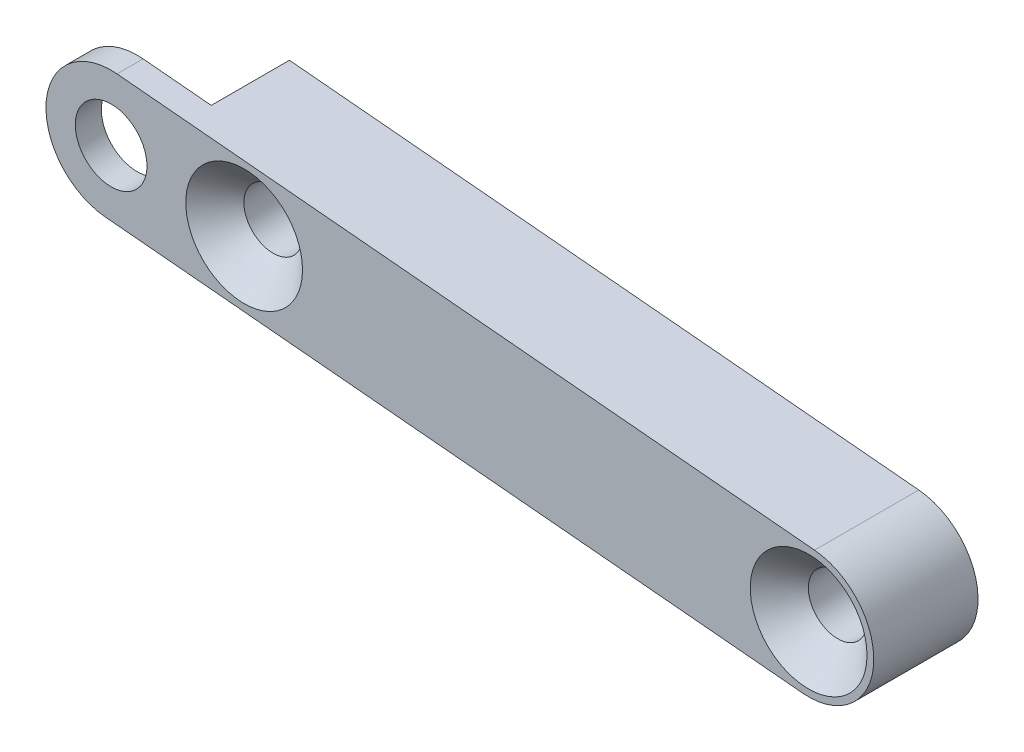
ISO-10303-21;
HEADER;
FILE_DESCRIPTION(('STEP AP214'),'2;1');
FILE_NAME('part.step','',(''),(''),'','','');
FILE_SCHEMA(('AUTOMOTIVE_DESIGN { 1 0 10303 214 1 1 1 1 }'));
ENDSEC;
DATA;
#1=APPLICATION_CONTEXT('core data for automotive mechanical design processes');
#2=APPLICATION_PROTOCOL_DEFINITION('international standard','automotive_design',2000,#1);
#3=PRODUCT_CONTEXT('',#1,'mechanical');
#4=PRODUCT('Part','Part','',(#3));
#5=PRODUCT_RELATED_PRODUCT_CATEGORY('part','',(#4));
#6=PRODUCT_DEFINITION_FORMATION('','',#4);
#7=PRODUCT_DEFINITION_CONTEXT('part definition',#1,'design');
#8=PRODUCT_DEFINITION('design','',#6,#7);
#9=PRODUCT_DEFINITION_SHAPE('','',#8);
#10=(LENGTH_UNIT() NAMED_UNIT(*) SI_UNIT(.MILLI.,.METRE.));
#11=(NAMED_UNIT(*) PLANE_ANGLE_UNIT() SI_UNIT($,.RADIAN.));
#12=(NAMED_UNIT(*) SI_UNIT($,.STERADIAN.) SOLID_ANGLE_UNIT());
#13=UNCERTAINTY_MEASURE_WITH_UNIT(LENGTH_MEASURE(1.E-05),#10,'distance_accuracy_value','');
#14=(GEOMETRIC_REPRESENTATION_CONTEXT(3) GLOBAL_UNCERTAINTY_ASSIGNED_CONTEXT((#13)) GLOBAL_UNIT_ASSIGNED_CONTEXT((#10,
#11,#12)) REPRESENTATION_CONTEXT('',''));
#15=CARTESIAN_POINT('',(0.,0.,0.));
#16=DIRECTION('',(0.,0.,1.));
#17=DIRECTION('',(1.,0.,0.));
#18=AXIS2_PLACEMENT_3D('',#15,#16,#17);
#19=CARTESIAN_POINT('',(39.8243195955887,35.0805183757008,-19.0881454656349));
#20=DIRECTION('',(0.,0.,1.));
#21=DIRECTION('',(1.,0.,0.));
#22=AXIS2_PLACEMENT_3D('',#19,#20,#21);
#23=CYLINDRICAL_SURFACE('',#22,5.);
#24=DIRECTION('',(0.,0.,1.));
#25=VECTOR('',#24,1.);
#26=CARTESIAN_POINT('',(40.2789154793188,40.0598097492294,-19.0881454656349));
#27=LINE('',#26,#25);
#28=CARTESIAN_POINT('',(40.2789154793188,40.0598097492294,6.));
#29=VERTEX_POINT('',#28);
#30=CARTESIAN_POINT('',(40.2789154793188,40.0598097492294,8.));
#31=VERTEX_POINT('',#30);
#32=EDGE_CURVE('E111',#29,#31,#27,.T.);
#33=ORIENTED_EDGE('',*,*,#32,.F.);
#34=CARTESIAN_POINT('',(39.8243195955887,35.0805183757008,6.));
#35=DIRECTION('',(0.,0.,-1.));
#36=DIRECTION('',(-1.,0.,0.));
#37=AXIS2_PLACEMENT_3D('',#34,#35,#36);
#38=CIRCLE('',#37,5.);
#39=CARTESIAN_POINT('',(39.3697237118586,30.1012270021723,6.));
#40=VERTEX_POINT('',#39);
#41=EDGE_CURVE('E11',#29,#40,#38,.F.);
#42=ORIENTED_EDGE('',*,*,#41,.T.);
#43=DIRECTION('',(0.,0.,1.));
#44=VECTOR('',#43,1.);
#45=CARTESIAN_POINT('',(39.3697237118586,30.1012270021723,-19.0881454656349));
#46=LINE('',#45,#44);
#47=CARTESIAN_POINT('',(39.3697237118586,30.1012270021723,8.));
#48=VERTEX_POINT('',#47);
#49=EDGE_CURVE('E130',#40,#48,#46,.T.);
#50=ORIENTED_EDGE('',*,*,#49,.T.);
#51=CARTESIAN_POINT('',(39.8243195955887,35.0805183757008,8.));
#52=DIRECTION('',(0.,0.,1.));
#53=DIRECTION('',(1.,0.,0.));
#54=AXIS2_PLACEMENT_3D('',#51,#52,#53);
#55=CIRCLE('',#54,5.);
#56=EDGE_CURVE('E133',#31,#48,#55,.T.);
#57=ORIENTED_EDGE('',*,*,#56,.F.);
#58=EDGE_LOOP('',(#33,#42,#50,#57));
#59=FACE_BOUND('',#58,.T.);
#60=ADVANCED_FACE('F35',(#59),#23,.T.);
#61=CARTESIAN_POINT('',(93.3517018610204,30.1936126256023,8.));
#62=DIRECTION('',(0.,0.,-1.));
#63=DIRECTION('',(-1.,0.,0.));
#64=AXIS2_PLACEMENT_3D('',#61,#62,#63);
#65=CYLINDRICAL_SURFACE('',#64,5.);
#66=CARTESIAN_POINT('',(93.3517018610204,30.1936126256023,0.));
#67=DIRECTION('',(0.,0.,1.));
#68=DIRECTION('',(1.,0.,0.));
#69=AXIS2_PLACEMENT_3D('',#66,#67,#68);
#70=CIRCLE('',#69,5.);
#71=CARTESIAN_POINT('',(92.8971059772903,25.2143212520737,0.));
#72=VERTEX_POINT('',#71);
#73=CARTESIAN_POINT('',(93.8062977447505,35.1729039991308,0.));
#74=VERTEX_POINT('',#73);
#75=EDGE_CURVE('E89',#72,#74,#70,.T.);
#76=ORIENTED_EDGE('',*,*,#75,.T.);
#77=DIRECTION('',(0.,0.,-1.));
#78=VECTOR('',#77,1.);
#79=CARTESIAN_POINT('',(93.8062977447505,35.1729039991308,8.));
#80=LINE('',#79,#78);
#81=CARTESIAN_POINT('',(93.8062977447505,35.1729039991308,8.));
#82=VERTEX_POINT('',#81);
#83=EDGE_CURVE('E43',#82,#74,#80,.T.);
#84=ORIENTED_EDGE('',*,*,#83,.F.);
#85=CARTESIAN_POINT('',(93.3517018610204,30.1936126256023,8.));
#86=DIRECTION('',(0.,0.,1.));
#87=DIRECTION('',(1.,0.,0.));
#88=AXIS2_PLACEMENT_3D('',#85,#86,#87);
#89=CIRCLE('',#88,5.);
#90=CARTESIAN_POINT('',(92.8971059772903,25.2143212520737,8.));
#91=VERTEX_POINT('',#90);
#92=EDGE_CURVE('E83',#91,#82,#89,.T.);
#93=ORIENTED_EDGE('',*,*,#92,.F.);
#94=DIRECTION('',(0.,0.,-1.));
#95=VECTOR('',#94,1.);
#96=CARTESIAN_POINT('',(92.8971059772903,25.2143212520737,8.));
#97=LINE('',#96,#95);
#98=EDGE_CURVE('E75',#91,#72,#97,.T.);
#99=ORIENTED_EDGE('',*,*,#98,.T.);
#100=EDGE_LOOP('',(#76,#84,#93,#99));
#101=FACE_BOUND('',#100,.T.);
#102=ADVANCED_FACE('F37',(#101),#65,.T.);
#103=CARTESIAN_POINT('',(93.8062977447505,35.1729039991308,8.));
#104=DIRECTION('',(-0.0909191767460206,-0.995858274705706,0.));
#105=DIRECTION('',(0.995858274705706,-0.0909191767460206,0.));
#106=AXIS2_PLACEMENT_3D('',#103,#104,#105);
#107=PLANE('',#106);
#108=DIRECTION('',(-0.995858274705706,0.0909191767460206,0.));
#109=VECTOR('',#108,1.);
#110=CARTESIAN_POINT('',(93.8062977447505,35.1729039991308,0.));
#111=LINE('',#110,#109);
#112=CARTESIAN_POINT('',(45.5071714215237,39.5824840713128,0.));
#113=VERTEX_POINT('',#112);
#114=EDGE_CURVE('E84',#74,#113,#111,.T.);
#115=ORIENTED_EDGE('',*,*,#114,.T.);
#116=DIRECTION('',(0.,0.,1.));
#117=VECTOR('',#116,1.);
#118=CARTESIAN_POINT('',(45.5071714215237,39.5824840713128,8.));
#119=LINE('',#118,#117);
#120=CARTESIAN_POINT('',(45.5071714215237,39.5824840713128,6.));
#121=VERTEX_POINT('',#120);
#122=EDGE_CURVE('E136',#113,#121,#119,.T.);
#123=ORIENTED_EDGE('',*,*,#122,.T.);
#124=DIRECTION('',(0.995858274705706,-0.0909191767460206,0.));
#125=VECTOR('',#124,1.);
#126=CARTESIAN_POINT('',(93.8062977447505,35.1729039991308,6.));
#127=LINE('',#126,#125);
#128=EDGE_CURVE('E139',#29,#121,#127,.T.);
#129=ORIENTED_EDGE('',*,*,#128,.F.);
#130=ORIENTED_EDGE('',*,*,#32,.T.);
#131=DIRECTION('',(-0.995858274705706,0.0909191767460206,0.));
#132=VECTOR('',#131,1.);
#133=CARTESIAN_POINT('',(93.8062977447505,35.1729039991308,8.));
#134=LINE('',#133,#132);
#135=EDGE_CURVE('E108',#82,#31,#134,.T.);
#136=ORIENTED_EDGE('',*,*,#135,.F.);
#137=ORIENTED_EDGE('',*,*,#83,.T.);
#138=EDGE_LOOP('',(#115,#123,#129,#130,#136,#137));
#139=FACE_BOUND('',#138,.T.);
#140=ADVANCED_FACE('F103',(#139),#107,.F.);
#141=CARTESIAN_POINT('',(92.8971059772903,25.2143212520737,8.));
#142=DIRECTION('',(0.0909191767460206,0.995858274705706,0.));
#143=DIRECTION('',(-0.995858274705706,0.0909191767460206,0.));
#144=AXIS2_PLACEMENT_3D('',#141,#142,#143);
#145=PLANE('',#144);
#146=DIRECTION('',(-0.995858274705706,0.0909191767460206,0.));
#147=VECTOR('',#146,1.);
#148=CARTESIAN_POINT('',(92.8971059772903,25.2143212520737,6.));
#149=LINE('',#148,#147);
#150=CARTESIAN_POINT('',(44.5979796540635,29.6239013242557,6.));
#151=VERTEX_POINT('',#150);
#152=EDGE_CURVE('E50',#151,#40,#149,.T.);
#153=ORIENTED_EDGE('',*,*,#152,.F.);
#154=DIRECTION('',(0.,0.,-1.));
#155=VECTOR('',#154,1.);
#156=CARTESIAN_POINT('',(44.5979796540635,29.6239013242557,8.));
#157=LINE('',#156,#155);
#158=CARTESIAN_POINT('',(44.5979796540635,29.6239013242557,0.));
#159=VERTEX_POINT('',#158);
#160=EDGE_CURVE('E79',#151,#159,#157,.T.);
#161=ORIENTED_EDGE('',*,*,#160,.T.);
#162=DIRECTION('',(0.995858274705706,-0.0909191767460206,0.));
#163=VECTOR('',#162,1.);
#164=CARTESIAN_POINT('',(92.8971059772903,25.2143212520737,0.));
#165=LINE('',#164,#163);
#166=EDGE_CURVE('E72',#159,#72,#165,.T.);
#167=ORIENTED_EDGE('',*,*,#166,.T.);
#168=ORIENTED_EDGE('',*,*,#98,.F.);
#169=DIRECTION('',(0.995858274705706,-0.0909191767460206,0.));
#170=VECTOR('',#169,1.);
#171=CARTESIAN_POINT('',(92.8971059772903,25.2143212520737,8.));
#172=LINE('',#171,#170);
#173=EDGE_CURVE('E58',#48,#91,#172,.T.);
#174=ORIENTED_EDGE('',*,*,#173,.F.);
#175=ORIENTED_EDGE('',*,*,#49,.F.);
#176=EDGE_LOOP('',(#153,#161,#167,#168,#174,#175));
#177=FACE_BOUND('',#176,.T.);
#178=ADVANCED_FACE('F74',(#177),#145,.F.);
#179=CARTESIAN_POINT('',(93.3517018610204,30.1936126256023,8.));
#180=DIRECTION('',(0.,0.,1.));
#181=DIRECTION('',(1.,0.,0.));
#182=AXIS2_PLACEMENT_3D('',#179,#180,#181);
#183=PLANE('',#182);
#184=CARTESIAN_POINT('',(39.8243195955887,35.0805183757008,8.));
#185=DIRECTION('',(0.,0.,1.));
#186=DIRECTION('',(1.,0.,0.));
#187=AXIS2_PLACEMENT_3D('',#184,#185,#186);
#188=CIRCLE('',#187,2.75);
#189=CARTESIAN_POINT('',(42.5743195955887,35.0805183757008,8.));
#190=VERTEX_POINT('',#189);
#191=EDGE_CURVE('E147',#190,#190,#188,.T.);
#192=ORIENTED_EDGE('',*,*,#191,.F.);
#193=EDGE_LOOP('',(#192));
#194=FACE_BOUND('',#193,.T.);
#195=CARTESIAN_POINT('',(93.3517018610204,30.1936126256023,8.));
#196=DIRECTION('',(0.,0.,1.));
#197=DIRECTION('',(1.,0.,0.));
#198=AXIS2_PLACEMENT_3D('',#195,#196,#197);
#199=CIRCLE('',#198,4.48);
#200=CARTESIAN_POINT('',(97.8317018610204,30.1936126256023,8.));
#201=VERTEX_POINT('',#200);
#202=EDGE_CURVE('E127',#201,#201,#199,.T.);
#203=ORIENTED_EDGE('',*,*,#202,.F.);
#204=EDGE_LOOP('',(#203));
#205=FACE_BOUND('',#204,.T.);
#206=CARTESIAN_POINT('',(50.0318669113222,34.1485968140541,8.));
#207=DIRECTION('',(0.,0.,1.));
#208=DIRECTION('',(1.,0.,0.));
#209=AXIS2_PLACEMENT_3D('',#206,#207,#208);
#210=CIRCLE('',#209,4.48);
#211=CARTESIAN_POINT('',(54.5118669113222,34.1485968140541,8.));
#212=VERTEX_POINT('',#211);
#213=EDGE_CURVE('E118',#212,#212,#210,.T.);
#214=ORIENTED_EDGE('',*,*,#213,.F.);
#215=EDGE_LOOP('',(#214));
#216=FACE_BOUND('',#215,.T.);
#217=ORIENTED_EDGE('',*,*,#92,.T.);
#218=ORIENTED_EDGE('',*,*,#135,.T.);
#219=ORIENTED_EDGE('',*,*,#56,.T.);
#220=ORIENTED_EDGE('',*,*,#173,.T.);
#221=EDGE_LOOP('',(#217,#218,#219,#220));
#222=FACE_BOUND('',#221,.T.);
#223=ADVANCED_FACE('F113',(#194,#205,#216,#222),#183,.T.);
#224=CARTESIAN_POINT('',(93.3517018610204,30.1936126256023,0.));
#225=DIRECTION('',(0.,0.,1.));
#226=DIRECTION('',(1.,0.,0.));
#227=AXIS2_PLACEMENT_3D('',#224,#225,#226);
#228=PLANE('',#227);
#229=CARTESIAN_POINT('',(93.3517018610204,30.1936126256023,0.));
#230=DIRECTION('',(0.,0.,1.));
#231=DIRECTION('',(1.,0.,0.));
#232=AXIS2_PLACEMENT_3D('',#229,#230,#231);
#233=CIRCLE('',#232,2.25);
#234=CARTESIAN_POINT('',(95.6017018610204,30.1936126256023,0.));
#235=VERTEX_POINT('',#234);
#236=EDGE_CURVE('E121',#235,#235,#233,.T.);
#237=ORIENTED_EDGE('',*,*,#236,.T.);
#238=EDGE_LOOP('',(#237));
#239=FACE_BOUND('',#238,.T.);
#240=CARTESIAN_POINT('',(50.0318669113222,34.1485968140541,0.));
#241=DIRECTION('',(0.,0.,1.));
#242=DIRECTION('',(1.,0.,0.));
#243=AXIS2_PLACEMENT_3D('',#240,#241,#242);
#244=CIRCLE('',#243,2.25);
#245=CARTESIAN_POINT('',(52.2818669113222,34.1485968140541,0.));
#246=VERTEX_POINT('',#245);
#247=EDGE_CURVE('E94',#246,#246,#244,.T.);
#248=ORIENTED_EDGE('',*,*,#247,.T.);
#249=EDGE_LOOP('',(#248));
#250=FACE_BOUND('',#249,.T.);
#251=ORIENTED_EDGE('',*,*,#166,.F.);
#252=DIRECTION('',(-0.0909191767460207,-0.995858274705706,0.));
#253=VECTOR('',#252,1.);
#254=CARTESIAN_POINT('',(45.5299012157102,39.8314486399892,0.));
#255=LINE('',#254,#253);
#256=EDGE_CURVE('E144',#113,#159,#255,.T.);
#257=ORIENTED_EDGE('',*,*,#256,.F.);
#258=ORIENTED_EDGE('',*,*,#114,.F.);
#259=ORIENTED_EDGE('',*,*,#75,.F.);
#260=EDGE_LOOP('',(#251,#257,#258,#259));
#261=FACE_BOUND('',#260,.T.);
#262=ADVANCED_FACE('F91',(#239,#250,#261),#228,.F.);
#263=CARTESIAN_POINT('',(50.0318669113222,34.1485968140541,8.));
#264=DIRECTION('',(0.,0.,1.));
#265=DIRECTION('',(1.,0.,0.));
#266=AXIS2_PLACEMENT_3D('',#263,#264,#265);
#267=CYLINDRICAL_SURFACE('',#266,2.25);
#268=ORIENTED_EDGE('',*,*,#247,.F.);
#269=EDGE_LOOP('',(#268));
#270=FACE_BOUND('',#269,.T.);
#271=CARTESIAN_POINT('',(50.0318669113222,34.1485968140541,5.77));
#272=DIRECTION('',(0.,0.,1.));
#273=DIRECTION('',(1.,0.,0.));
#274=AXIS2_PLACEMENT_3D('',#271,#272,#273);
#275=CIRCLE('',#274,2.25);
#276=CARTESIAN_POINT('',(52.2818669113222,34.1485968140541,5.77));
#277=VERTEX_POINT('',#276);
#278=EDGE_CURVE('E98',#277,#277,#275,.T.);
#279=ORIENTED_EDGE('',*,*,#278,.T.);
#280=EDGE_LOOP('',(#279));
#281=FACE_BOUND('',#280,.T.);
#282=ADVANCED_FACE('F194',(#270,#281),#267,.F.);
#283=CARTESIAN_POINT('',(50.0318669113222,34.1485968140541,8.));
#284=DIRECTION('',(0.,0.,1.));
#285=DIRECTION('',(1.,0.,0.));
#286=AXIS2_PLACEMENT_3D('',#283,#284,#285);
#287=CONICAL_SURFACE('',#286,4.48,0.785398163397447);
#288=ORIENTED_EDGE('',*,*,#278,.F.);
#289=EDGE_LOOP('',(#288));
#290=FACE_BOUND('',#289,.T.);
#291=ORIENTED_EDGE('',*,*,#213,.T.);
#292=EDGE_LOOP('',(#291));
#293=FACE_BOUND('',#292,.T.);
#294=ADVANCED_FACE('F190',(#290,#293),#287,.F.);
#295=CARTESIAN_POINT('',(93.3517018610204,30.1936126256023,8.));
#296=DIRECTION('',(0.,0.,1.));
#297=DIRECTION('',(1.,0.,0.));
#298=AXIS2_PLACEMENT_3D('',#295,#296,#297);
#299=CYLINDRICAL_SURFACE('',#298,2.25);
#300=ORIENTED_EDGE('',*,*,#236,.F.);
#301=EDGE_LOOP('',(#300));
#302=FACE_BOUND('',#301,.T.);
#303=CARTESIAN_POINT('',(93.3517018610204,30.1936126256023,5.77));
#304=DIRECTION('',(0.,0.,1.));
#305=DIRECTION('',(1.,0.,0.));
#306=AXIS2_PLACEMENT_3D('',#303,#304,#305);
#307=CIRCLE('',#306,2.25);
#308=CARTESIAN_POINT('',(95.6017018610204,30.1936126256023,5.77));
#309=VERTEX_POINT('',#308);
#310=EDGE_CURVE('E124',#309,#309,#307,.T.);
#311=ORIENTED_EDGE('',*,*,#310,.T.);
#312=EDGE_LOOP('',(#311));
#313=FACE_BOUND('',#312,.T.);
#314=ADVANCED_FACE('F186',(#302,#313),#299,.F.);
#315=CARTESIAN_POINT('',(93.3517018610204,30.1936126256023,8.));
#316=DIRECTION('',(0.,0.,1.));
#317=DIRECTION('',(1.,0.,0.));
#318=AXIS2_PLACEMENT_3D('',#315,#316,#317);
#319=CONICAL_SURFACE('',#318,4.48,0.785398163397447);
#320=ORIENTED_EDGE('',*,*,#310,.F.);
#321=EDGE_LOOP('',(#320));
#322=FACE_BOUND('',#321,.T.);
#323=ORIENTED_EDGE('',*,*,#202,.T.);
#324=EDGE_LOOP('',(#323));
#325=FACE_BOUND('',#324,.T.);
#326=ADVANCED_FACE('F183',(#322,#325),#319,.F.);
#327=CARTESIAN_POINT('',(45.5299012157102,39.8314486399892,6.));
#328=DIRECTION('',(0.995858274705706,-0.0909191767460207,0.));
#329=DIRECTION('',(0.0909191767460207,0.995858274705706,0.));
#330=AXIS2_PLACEMENT_3D('',#327,#328,#329);
#331=PLANE('',#330);
#332=ORIENTED_EDGE('',*,*,#256,.T.);
#333=ORIENTED_EDGE('',*,*,#160,.F.);
#334=DIRECTION('',(-0.0909191767460207,-0.995858274705706,0.));
#335=VECTOR('',#334,1.);
#336=CARTESIAN_POINT('',(45.5299012157102,39.8314486399892,6.));
#337=LINE('',#336,#335);
#338=EDGE_CURVE('E143',#121,#151,#337,.T.);
#339=ORIENTED_EDGE('',*,*,#338,.F.);
#340=ORIENTED_EDGE('',*,*,#122,.F.);
#341=EDGE_LOOP('',(#332,#333,#339,#340));
#342=FACE_BOUND('',#341,.T.);
#343=ADVANCED_FACE('F160',(#342),#331,.F.);
#344=CARTESIAN_POINT('',(39.8243195955887,35.0805183757008,6.));
#345=DIRECTION('',(0.,0.,-1.));
#346=DIRECTION('',(-1.,0.,0.));
#347=AXIS2_PLACEMENT_3D('',#344,#345,#346);
#348=PLANE('',#347);
#349=CARTESIAN_POINT('',(39.8243195955887,35.0805183757008,6.));
#350=DIRECTION('',(0.,0.,-1.));
#351=DIRECTION('',(-1.,0.,0.));
#352=AXIS2_PLACEMENT_3D('',#349,#350,#351);
#353=CIRCLE('',#352,2.75);
#354=CARTESIAN_POINT('',(37.0743195955887,35.0805183757008,6.));
#355=VERTEX_POINT('',#354);
#356=EDGE_CURVE('E151',#355,#355,#353,.T.);
#357=ORIENTED_EDGE('',*,*,#356,.F.);
#358=EDGE_LOOP('',(#357));
#359=FACE_BOUND('',#358,.T.);
#360=ORIENTED_EDGE('',*,*,#128,.T.);
#361=ORIENTED_EDGE('',*,*,#338,.T.);
#362=ORIENTED_EDGE('',*,*,#152,.T.);
#363=ORIENTED_EDGE('',*,*,#41,.F.);
#364=EDGE_LOOP('',(#360,#361,#362,#363));
#365=FACE_BOUND('',#364,.T.);
#366=ADVANCED_FACE('F158',(#359,#365),#348,.T.);
#367=CARTESIAN_POINT('',(39.8243195955887,35.0805183757008,6.));
#368=DIRECTION('',(0.,0.,-1.));
#369=DIRECTION('',(-1.,0.,0.));
#370=AXIS2_PLACEMENT_3D('',#367,#368,#369);
#371=CYLINDRICAL_SURFACE('',#370,2.75);
#372=ORIENTED_EDGE('',*,*,#356,.T.);
#373=EDGE_LOOP('',(#372));
#374=FACE_BOUND('',#373,.T.);
#375=ORIENTED_EDGE('',*,*,#191,.T.);
#376=EDGE_LOOP('',(#375));
#377=FACE_BOUND('',#376,.T.);
#378=ADVANCED_FACE('F155',(#374,#377),#371,.F.);
#379=CLOSED_SHELL('',(#60,#102,#140,#178,#223,#262,#282,#294,#314,#326,#343,#366,#378));
#380=MANIFOLD_SOLID_BREP('B2',#379);
#381=ADVANCED_BREP_SHAPE_REPRESENTATION('',(#18,#380),#14);
#382=SHAPE_DEFINITION_REPRESENTATION(#9,#381);
ENDSEC;
END-ISO-10303-21;
